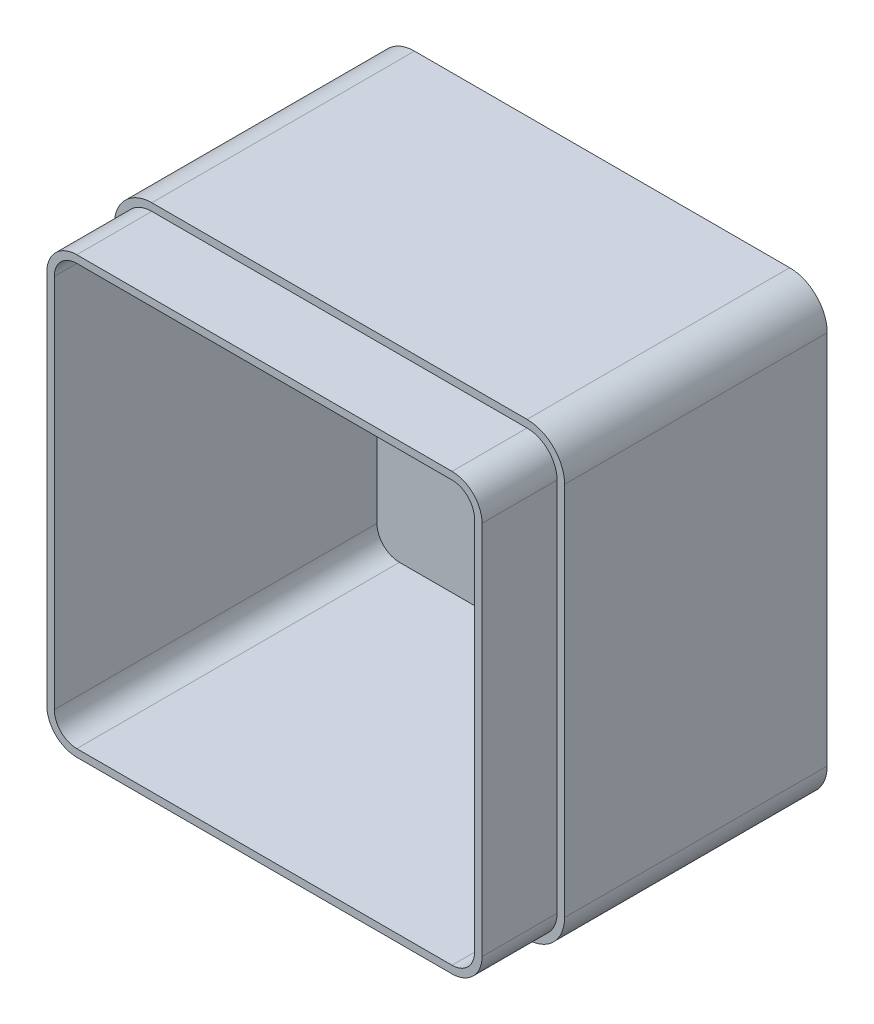
ISO-10303-21;
HEADER;
FILE_DESCRIPTION(('STEP AP214'),'2;1');
FILE_NAME('part.step','',(''),(''),'','','');
FILE_SCHEMA(('AUTOMOTIVE_DESIGN { 1 0 10303 214 1 1 1 1 }'));
ENDSEC;
DATA;
#1=APPLICATION_CONTEXT('core data for automotive mechanical design processes');
#2=APPLICATION_PROTOCOL_DEFINITION('international standard','automotive_design',2000,#1);
#3=PRODUCT_CONTEXT('',#1,'mechanical');
#4=PRODUCT('Part','Part','',(#3));
#5=PRODUCT_RELATED_PRODUCT_CATEGORY('part','',(#4));
#6=PRODUCT_DEFINITION_FORMATION('','',#4);
#7=PRODUCT_DEFINITION_CONTEXT('part definition',#1,'design');
#8=PRODUCT_DEFINITION('design','',#6,#7);
#9=PRODUCT_DEFINITION_SHAPE('','',#8);
#10=(LENGTH_UNIT() NAMED_UNIT(*) SI_UNIT(.MILLI.,.METRE.));
#11=(NAMED_UNIT(*) PLANE_ANGLE_UNIT() SI_UNIT($,.RADIAN.));
#12=(NAMED_UNIT(*) SI_UNIT($,.STERADIAN.) SOLID_ANGLE_UNIT());
#13=UNCERTAINTY_MEASURE_WITH_UNIT(LENGTH_MEASURE(1.E-05),#10,'distance_accuracy_value','');
#14=(GEOMETRIC_REPRESENTATION_CONTEXT(3) GLOBAL_UNCERTAINTY_ASSIGNED_CONTEXT((#13)) GLOBAL_UNIT_ASSIGNED_CONTEXT((#10,
#11,#12)) REPRESENTATION_CONTEXT('',''));
#15=CARTESIAN_POINT('',(0.,0.,0.));
#16=DIRECTION('',(0.,0.,1.));
#17=DIRECTION('',(1.,0.,0.));
#18=AXIS2_PLACEMENT_3D('',#15,#16,#17);
#19=CARTESIAN_POINT('',(0.,0.,90.));
#20=DIRECTION('',(0.,0.,1.));
#21=DIRECTION('',(1.,0.,0.));
#22=AXIS2_PLACEMENT_3D('',#19,#20,#21);
#23=PLANE('',#22);
#24=DIRECTION('',(0.,-1.,0.));
#25=VECTOR('',#24,1.);
#26=CARTESIAN_POINT('',(4.,0.,90.));
#27=LINE('',#26,#25);
#28=CARTESIAN_POINT('',(4.,-10.,90.));
#29=VERTEX_POINT('',#28);
#30=CARTESIAN_POINT('',(4.00000000000001,-110.,90.));
#31=VERTEX_POINT('',#30);
#32=EDGE_CURVE('E350',#29,#31,#27,.T.);
#33=ORIENTED_EDGE('',*,*,#32,.F.);
#34=CARTESIAN_POINT('',(10.,-10.,90.));
#35=DIRECTION('',(0.,0.,1.));
#36=DIRECTION('',(1.,0.,0.));
#37=AXIS2_PLACEMENT_3D('',#34,#35,#36);
#38=CIRCLE('',#37,6.);
#39=CARTESIAN_POINT('',(10.,-4.,90.));
#40=VERTEX_POINT('',#39);
#41=EDGE_CURVE('E328',#40,#29,#38,.T.);
#42=ORIENTED_EDGE('',*,*,#41,.F.);
#43=DIRECTION('',(-1.,0.,0.));
#44=VECTOR('',#43,1.);
#45=CARTESIAN_POINT('',(0.,-4.,90.));
#46=LINE('',#45,#44);
#47=CARTESIAN_POINT('',(110.,-4.,90.));
#48=VERTEX_POINT('',#47);
#49=EDGE_CURVE('E364',#48,#40,#46,.T.);
#50=ORIENTED_EDGE('',*,*,#49,.F.);
#51=CARTESIAN_POINT('',(110.,-10.,90.));
#52=DIRECTION('',(0.,0.,1.));
#53=DIRECTION('',(1.,0.,0.));
#54=AXIS2_PLACEMENT_3D('',#51,#52,#53);
#55=CIRCLE('',#54,6.);
#56=CARTESIAN_POINT('',(116.,-10.,90.));
#57=VERTEX_POINT('',#56);
#58=EDGE_CURVE('E395',#57,#48,#55,.T.);
#59=ORIENTED_EDGE('',*,*,#58,.F.);
#60=DIRECTION('',(0.,1.,0.));
#61=VECTOR('',#60,1.);
#62=CARTESIAN_POINT('',(116.,0.,90.));
#63=LINE('',#62,#61);
#64=CARTESIAN_POINT('',(116.,-110.,90.));
#65=VERTEX_POINT('',#64);
#66=EDGE_CURVE('E392',#65,#57,#63,.T.);
#67=ORIENTED_EDGE('',*,*,#66,.F.);
#68=CARTESIAN_POINT('',(110.,-110.,90.));
#69=DIRECTION('',(0.,0.,1.));
#70=DIRECTION('',(1.,0.,0.));
#71=AXIS2_PLACEMENT_3D('',#68,#69,#70);
#72=CIRCLE('',#71,6.);
#73=CARTESIAN_POINT('',(110.,-116.,90.));
#74=VERTEX_POINT('',#73);
#75=EDGE_CURVE('E388',#74,#65,#72,.T.);
#76=ORIENTED_EDGE('',*,*,#75,.F.);
#77=DIRECTION('',(1.,0.,0.));
#78=VECTOR('',#77,1.);
#79=CARTESIAN_POINT('',(0.,-116.,90.));
#80=LINE('',#79,#78);
#81=CARTESIAN_POINT('',(10.,-116.,90.));
#82=VERTEX_POINT('',#81);
#83=EDGE_CURVE('E385',#82,#74,#80,.T.);
#84=ORIENTED_EDGE('',*,*,#83,.F.);
#85=CARTESIAN_POINT('',(10.,-110.,90.));
#86=DIRECTION('',(0.,0.,1.));
#87=DIRECTION('',(1.,0.,0.));
#88=AXIS2_PLACEMENT_3D('',#85,#86,#87);
#89=CIRCLE('',#88,6.);
#90=EDGE_CURVE('E373',#31,#82,#89,.T.);
#91=ORIENTED_EDGE('',*,*,#90,.F.);
#92=EDGE_LOOP('',(#33,#42,#50,#59,#67,#76,#84,#91));
#93=FACE_BOUND('',#92,.T.);
#94=DIRECTION('',(-1.,0.,0.));
#95=VECTOR('',#94,1.);
#96=CARTESIAN_POINT('',(110.,-2.,90.));
#97=LINE('',#96,#95);
#98=CARTESIAN_POINT('',(110.,-2.,90.));
#99=VERTEX_POINT('',#98);
#100=CARTESIAN_POINT('',(9.99999999999999,-2.,90.));
#101=VERTEX_POINT('',#100);
#102=EDGE_CURVE('E229',#99,#101,#97,.T.);
#103=ORIENTED_EDGE('',*,*,#102,.T.);
#104=CARTESIAN_POINT('',(10.,-10.,90.));
#105=DIRECTION('',(0.,0.,1.));
#106=DIRECTION('',(1.,0.,0.));
#107=AXIS2_PLACEMENT_3D('',#104,#105,#106);
#108=CIRCLE('',#107,8.);
#109=CARTESIAN_POINT('',(2.,-10.,90.));
#110=VERTEX_POINT('',#109);
#111=EDGE_CURVE('E256',#101,#110,#108,.T.);
#112=ORIENTED_EDGE('',*,*,#111,.T.);
#113=DIRECTION('',(0.,-1.,0.));
#114=VECTOR('',#113,1.);
#115=CARTESIAN_POINT('',(2.,-10.,90.));
#116=LINE('',#115,#114);
#117=CARTESIAN_POINT('',(2.,-110.,90.));
#118=VERTEX_POINT('',#117);
#119=EDGE_CURVE('E206',#110,#118,#116,.T.);
#120=ORIENTED_EDGE('',*,*,#119,.T.);
#121=CARTESIAN_POINT('',(10.,-110.,90.));
#122=DIRECTION('',(0.,0.,1.));
#123=DIRECTION('',(1.,0.,0.));
#124=AXIS2_PLACEMENT_3D('',#121,#122,#123);
#125=CIRCLE('',#124,8.);
#126=CARTESIAN_POINT('',(10.,-118.,90.));
#127=VERTEX_POINT('',#126);
#128=EDGE_CURVE('E55',#118,#127,#125,.T.);
#129=ORIENTED_EDGE('',*,*,#128,.T.);
#130=DIRECTION('',(1.,0.,0.));
#131=VECTOR('',#130,1.);
#132=CARTESIAN_POINT('',(10.,-118.,90.));
#133=LINE('',#132,#131);
#134=CARTESIAN_POINT('',(110.,-118.,90.));
#135=VERTEX_POINT('',#134);
#136=EDGE_CURVE('E263',#127,#135,#133,.T.);
#137=ORIENTED_EDGE('',*,*,#136,.T.);
#138=CARTESIAN_POINT('',(110.,-110.,90.));
#139=DIRECTION('',(0.,0.,1.));
#140=DIRECTION('',(1.,0.,0.));
#141=AXIS2_PLACEMENT_3D('',#138,#139,#140);
#142=CIRCLE('',#141,7.99999999999999);
#143=CARTESIAN_POINT('',(118.,-110.,90.));
#144=VERTEX_POINT('',#143);
#145=EDGE_CURVE('E267',#135,#144,#142,.T.);
#146=ORIENTED_EDGE('',*,*,#145,.T.);
#147=DIRECTION('',(0.,1.,0.));
#148=VECTOR('',#147,1.);
#149=CARTESIAN_POINT('',(118.,-110.,90.));
#150=LINE('',#149,#148);
#151=CARTESIAN_POINT('',(118.,-9.99999999999999,90.));
#152=VERTEX_POINT('',#151);
#153=EDGE_CURVE('E271',#144,#152,#150,.T.);
#154=ORIENTED_EDGE('',*,*,#153,.T.);
#155=CARTESIAN_POINT('',(110.,-10.,90.));
#156=DIRECTION('',(0.,0.,1.));
#157=DIRECTION('',(1.,0.,0.));
#158=AXIS2_PLACEMENT_3D('',#155,#156,#157);
#159=CIRCLE('',#158,8.);
#160=EDGE_CURVE('E233',#152,#99,#159,.T.);
#161=ORIENTED_EDGE('',*,*,#160,.T.);
#162=EDGE_LOOP('',(#103,#112,#120,#129,#137,#146,#154,#161));
#163=FACE_BOUND('',#162,.T.);
#164=ADVANCED_FACE('F39',(#93,#163),#23,.T.);
#165=CARTESIAN_POINT('',(4.,0.,90.));
#166=DIRECTION('',(1.,0.,0.));
#167=DIRECTION('',(0.,1.,0.));
#168=AXIS2_PLACEMENT_3D('',#165,#166,#167);
#169=PLANE('',#168);
#170=DIRECTION('',(0.,-1.,0.));
#171=VECTOR('',#170,1.);
#172=CARTESIAN_POINT('',(4.,0.,4.));
#173=LINE('',#172,#171);
#174=CARTESIAN_POINT('',(4.,-10.,4.));
#175=VERTEX_POINT('',#174);
#176=CARTESIAN_POINT('',(4.00000000000001,-110.,4.));
#177=VERTEX_POINT('',#176);
#178=EDGE_CURVE('E320',#175,#177,#173,.T.);
#179=ORIENTED_EDGE('',*,*,#178,.F.);
#180=DIRECTION('',(0.,0.,1.));
#181=VECTOR('',#180,1.);
#182=CARTESIAN_POINT('',(4.,-10.,90.));
#183=LINE('',#182,#181);
#184=EDGE_CURVE('E329',#29,#175,#183,.F.);
#185=ORIENTED_EDGE('',*,*,#184,.F.);
#186=ORIENTED_EDGE('',*,*,#32,.T.);
#187=DIRECTION('',(0.,0.,1.));
#188=VECTOR('',#187,1.);
#189=CARTESIAN_POINT('',(4.00000000000001,-110.,90.));
#190=LINE('',#189,#188);
#191=EDGE_CURVE('E325',#177,#31,#190,.T.);
#192=ORIENTED_EDGE('',*,*,#191,.F.);
#193=EDGE_LOOP('',(#179,#185,#186,#192));
#194=FACE_BOUND('',#193,.T.);
#195=ADVANCED_FACE('F504',(#194),#169,.T.);
#196=CARTESIAN_POINT('',(0.,-116.,90.));
#197=DIRECTION('',(0.,1.,0.));
#198=DIRECTION('',(0.,0.,1.));
#199=AXIS2_PLACEMENT_3D('',#196,#197,#198);
#200=PLANE('',#199);
#201=ORIENTED_EDGE('',*,*,#83,.T.);
#202=DIRECTION('',(0.,0.,1.));
#203=VECTOR('',#202,1.);
#204=CARTESIAN_POINT('',(110.,-116.,90.));
#205=LINE('',#204,#203);
#206=CARTESIAN_POINT('',(110.,-116.,4.));
#207=VERTEX_POINT('',#206);
#208=EDGE_CURVE('E361',#207,#74,#205,.T.);
#209=ORIENTED_EDGE('',*,*,#208,.F.);
#210=DIRECTION('',(1.,0.,0.));
#211=VECTOR('',#210,1.);
#212=CARTESIAN_POINT('',(0.,-116.,4.));
#213=LINE('',#212,#211);
#214=CARTESIAN_POINT('',(10.,-116.,4.));
#215=VERTEX_POINT('',#214);
#216=EDGE_CURVE('E324',#215,#207,#213,.T.);
#217=ORIENTED_EDGE('',*,*,#216,.F.);
#218=DIRECTION('',(0.,0.,1.));
#219=VECTOR('',#218,1.);
#220=CARTESIAN_POINT('',(10.,-116.,90.));
#221=LINE('',#220,#219);
#222=EDGE_CURVE('E345',#82,#215,#221,.F.);
#223=ORIENTED_EDGE('',*,*,#222,.F.);
#224=EDGE_LOOP('',(#201,#209,#217,#223));
#225=FACE_BOUND('',#224,.T.);
#226=ADVANCED_FACE('F509',(#225),#200,.T.);
#227=CARTESIAN_POINT('',(116.,0.,90.));
#228=DIRECTION('',(-1.,0.,0.));
#229=DIRECTION('',(0.,-1.,0.));
#230=AXIS2_PLACEMENT_3D('',#227,#228,#229);
#231=PLANE('',#230);
#232=ORIENTED_EDGE('',*,*,#66,.T.);
#233=DIRECTION('',(0.,0.,1.));
#234=VECTOR('',#233,1.);
#235=CARTESIAN_POINT('',(116.,-10.,90.));
#236=LINE('',#235,#234);
#237=CARTESIAN_POINT('',(116.,-10.,4.));
#238=VERTEX_POINT('',#237);
#239=EDGE_CURVE('E370',#238,#57,#236,.T.);
#240=ORIENTED_EDGE('',*,*,#239,.F.);
#241=DIRECTION('',(0.,1.,0.));
#242=VECTOR('',#241,1.);
#243=CARTESIAN_POINT('',(116.,0.,4.));
#244=LINE('',#243,#242);
#245=CARTESIAN_POINT('',(116.,-110.,4.));
#246=VERTEX_POINT('',#245);
#247=EDGE_CURVE('E337',#246,#238,#244,.T.);
#248=ORIENTED_EDGE('',*,*,#247,.F.);
#249=DIRECTION('',(0.,0.,1.));
#250=VECTOR('',#249,1.);
#251=CARTESIAN_POINT('',(116.,-110.,90.));
#252=LINE('',#251,#250);
#253=EDGE_CURVE('E365',#65,#246,#252,.F.);
#254=ORIENTED_EDGE('',*,*,#253,.F.);
#255=EDGE_LOOP('',(#232,#240,#248,#254));
#256=FACE_BOUND('',#255,.T.);
#257=ADVANCED_FACE('F538',(#256),#231,.T.);
#258=CARTESIAN_POINT('',(0.,-4.,90.));
#259=DIRECTION('',(0.,-1.,0.));
#260=DIRECTION('',(0.,0.,-1.));
#261=AXIS2_PLACEMENT_3D('',#258,#259,#260);
#262=PLANE('',#261);
#263=ORIENTED_EDGE('',*,*,#49,.T.);
#264=DIRECTION('',(0.,0.,-1.));
#265=VECTOR('',#264,1.);
#266=CARTESIAN_POINT('',(10.,-4.,90.));
#267=LINE('',#266,#265);
#268=CARTESIAN_POINT('',(10.,-4.,4.));
#269=VERTEX_POINT('',#268);
#270=EDGE_CURVE('E369',#269,#40,#267,.F.);
#271=ORIENTED_EDGE('',*,*,#270,.F.);
#272=DIRECTION('',(-1.,0.,0.));
#273=VECTOR('',#272,1.);
#274=CARTESIAN_POINT('',(0.,-4.,4.));
#275=LINE('',#274,#273);
#276=CARTESIAN_POINT('',(110.,-4.,4.));
#277=VERTEX_POINT('',#276);
#278=EDGE_CURVE('E346',#277,#269,#275,.T.);
#279=ORIENTED_EDGE('',*,*,#278,.F.);
#280=DIRECTION('',(0.,0.,-1.));
#281=VECTOR('',#280,1.);
#282=CARTESIAN_POINT('',(110.,-4.,90.));
#283=LINE('',#282,#281);
#284=EDGE_CURVE('E374',#48,#277,#283,.T.);
#285=ORIENTED_EDGE('',*,*,#284,.F.);
#286=EDGE_LOOP('',(#263,#271,#279,#285));
#287=FACE_BOUND('',#286,.T.);
#288=ADVANCED_FACE('F534',(#287),#262,.T.);
#289=CARTESIAN_POINT('',(0.,0.,4.));
#290=DIRECTION('',(0.,0.,1.));
#291=DIRECTION('',(1.,0.,0.));
#292=AXIS2_PLACEMENT_3D('',#289,#290,#291);
#293=PLANE('',#292);
#294=ORIENTED_EDGE('',*,*,#216,.T.);
#295=CARTESIAN_POINT('',(110.,-110.,4.));
#296=DIRECTION('',(0.,0.,1.));
#297=DIRECTION('',(1.,0.,0.));
#298=AXIS2_PLACEMENT_3D('',#295,#296,#297);
#299=CIRCLE('',#298,6.);
#300=EDGE_CURVE('E340',#246,#207,#299,.F.);
#301=ORIENTED_EDGE('',*,*,#300,.F.);
#302=ORIENTED_EDGE('',*,*,#247,.T.);
#303=CARTESIAN_POINT('',(110.,-10.,4.));
#304=DIRECTION('',(0.,0.,1.));
#305=DIRECTION('',(1.,0.,0.));
#306=AXIS2_PLACEMENT_3D('',#303,#304,#305);
#307=CIRCLE('',#306,6.);
#308=EDGE_CURVE('E344',#277,#238,#307,.F.);
#309=ORIENTED_EDGE('',*,*,#308,.F.);
#310=ORIENTED_EDGE('',*,*,#278,.T.);
#311=CARTESIAN_POINT('',(10.,-10.,4.));
#312=DIRECTION('',(0.,0.,1.));
#313=DIRECTION('',(1.,0.,0.));
#314=AXIS2_PLACEMENT_3D('',#311,#312,#313);
#315=CIRCLE('',#314,6.);
#316=EDGE_CURVE('E341',#175,#269,#315,.F.);
#317=ORIENTED_EDGE('',*,*,#316,.F.);
#318=ORIENTED_EDGE('',*,*,#178,.T.);
#319=CARTESIAN_POINT('',(10.,-110.,4.));
#320=DIRECTION('',(0.,0.,1.));
#321=DIRECTION('',(1.,0.,0.));
#322=AXIS2_PLACEMENT_3D('',#319,#320,#321);
#323=CIRCLE('',#322,6.);
#324=EDGE_CURVE('E333',#215,#177,#323,.F.);
#325=ORIENTED_EDGE('',*,*,#324,.F.);
#326=EDGE_LOOP('',(#294,#301,#302,#309,#310,#317,#318,#325));
#327=FACE_BOUND('',#326,.T.);
#328=ADVANCED_FACE('F530',(#327),#293,.T.);
#329=CARTESIAN_POINT('',(10.,-110.,90.));
#330=DIRECTION('',(0.,0.,-1.));
#331=DIRECTION('',(-1.,0.,0.));
#332=AXIS2_PLACEMENT_3D('',#329,#330,#331);
#333=CYLINDRICAL_SURFACE('',#332,6.);
#334=ORIENTED_EDGE('',*,*,#90,.T.);
#335=ORIENTED_EDGE('',*,*,#222,.T.);
#336=ORIENTED_EDGE('',*,*,#324,.T.);
#337=ORIENTED_EDGE('',*,*,#191,.T.);
#338=EDGE_LOOP('',(#334,#335,#336,#337));
#339=FACE_BOUND('',#338,.T.);
#340=ADVANCED_FACE('F526',(#339),#333,.F.);
#341=CARTESIAN_POINT('',(110.,-110.,90.));
#342=DIRECTION('',(0.,0.,-1.));
#343=DIRECTION('',(-1.,0.,0.));
#344=AXIS2_PLACEMENT_3D('',#341,#342,#343);
#345=CYLINDRICAL_SURFACE('',#344,6.);
#346=ORIENTED_EDGE('',*,*,#75,.T.);
#347=ORIENTED_EDGE('',*,*,#253,.T.);
#348=ORIENTED_EDGE('',*,*,#300,.T.);
#349=ORIENTED_EDGE('',*,*,#208,.T.);
#350=EDGE_LOOP('',(#346,#347,#348,#349));
#351=FACE_BOUND('',#350,.T.);
#352=ADVANCED_FACE('F522',(#351),#345,.F.);
#353=CARTESIAN_POINT('',(110.,-10.,90.));
#354=DIRECTION('',(0.,0.,-1.));
#355=DIRECTION('',(-1.,0.,0.));
#356=AXIS2_PLACEMENT_3D('',#353,#354,#355);
#357=CYLINDRICAL_SURFACE('',#356,6.);
#358=ORIENTED_EDGE('',*,*,#58,.T.);
#359=ORIENTED_EDGE('',*,*,#284,.T.);
#360=ORIENTED_EDGE('',*,*,#308,.T.);
#361=ORIENTED_EDGE('',*,*,#239,.T.);
#362=EDGE_LOOP('',(#358,#359,#360,#361));
#363=FACE_BOUND('',#362,.T.);
#364=ADVANCED_FACE('F518',(#363),#357,.F.);
#365=CARTESIAN_POINT('',(10.,-10.,90.));
#366=DIRECTION('',(0.,0.,-1.));
#367=DIRECTION('',(-1.,0.,0.));
#368=AXIS2_PLACEMENT_3D('',#365,#366,#367);
#369=CYLINDRICAL_SURFACE('',#368,6.);
#370=ORIENTED_EDGE('',*,*,#41,.T.);
#371=ORIENTED_EDGE('',*,*,#184,.T.);
#372=ORIENTED_EDGE('',*,*,#316,.T.);
#373=ORIENTED_EDGE('',*,*,#270,.T.);
#374=EDGE_LOOP('',(#370,#371,#372,#373));
#375=FACE_BOUND('',#374,.T.);
#376=ADVANCED_FACE('F515',(#375),#369,.F.);
#377=CARTESIAN_POINT('',(10.,-10.,70.));
#378=DIRECTION('',(0.,0.,1.));
#379=DIRECTION('',(1.,0.,0.));
#380=AXIS2_PLACEMENT_3D('',#377,#378,#379);
#381=PLANE('',#380);
#382=DIRECTION('',(-1.,0.,0.));
#383=VECTOR('',#382,1.);
#384=CARTESIAN_POINT('',(110.,-2.,70.));
#385=LINE('',#384,#383);
#386=CARTESIAN_POINT('',(110.,-2.,70.));
#387=VERTEX_POINT('',#386);
#388=CARTESIAN_POINT('',(9.99999999999999,-2.,70.));
#389=VERTEX_POINT('',#388);
#390=EDGE_CURVE('E213',#387,#389,#385,.T.);
#391=ORIENTED_EDGE('',*,*,#390,.F.);
#392=CARTESIAN_POINT('',(110.,-10.,70.));
#393=DIRECTION('',(0.,0.,1.));
#394=DIRECTION('',(1.,0.,0.));
#395=AXIS2_PLACEMENT_3D('',#392,#393,#394);
#396=CIRCLE('',#395,8.);
#397=CARTESIAN_POINT('',(118.,-9.99999999999999,70.));
#398=VERTEX_POINT('',#397);
#399=EDGE_CURVE('E250',#398,#387,#396,.T.);
#400=ORIENTED_EDGE('',*,*,#399,.F.);
#401=DIRECTION('',(0.,1.,0.));
#402=VECTOR('',#401,1.);
#403=CARTESIAN_POINT('',(118.,-110.,70.));
#404=LINE('',#403,#402);
#405=CARTESIAN_POINT('',(118.,-110.,70.));
#406=VERTEX_POINT('',#405);
#407=EDGE_CURVE('E246',#406,#398,#404,.T.);
#408=ORIENTED_EDGE('',*,*,#407,.F.);
#409=CARTESIAN_POINT('',(110.,-110.,70.));
#410=DIRECTION('',(0.,0.,1.));
#411=DIRECTION('',(1.,0.,0.));
#412=AXIS2_PLACEMENT_3D('',#409,#410,#411);
#413=CIRCLE('',#412,7.99999999999999);
#414=CARTESIAN_POINT('',(110.,-118.,70.));
#415=VERTEX_POINT('',#414);
#416=EDGE_CURVE('E242',#415,#406,#413,.T.);
#417=ORIENTED_EDGE('',*,*,#416,.F.);
#418=DIRECTION('',(1.,0.,0.));
#419=VECTOR('',#418,1.);
#420=CARTESIAN_POINT('',(10.,-118.,70.));
#421=LINE('',#420,#419);
#422=CARTESIAN_POINT('',(10.,-118.,70.));
#423=VERTEX_POINT('',#422);
#424=EDGE_CURVE('E238',#423,#415,#421,.T.);
#425=ORIENTED_EDGE('',*,*,#424,.F.);
#426=CARTESIAN_POINT('',(10.,-110.,70.));
#427=DIRECTION('',(0.,0.,1.));
#428=DIRECTION('',(1.,0.,0.));
#429=AXIS2_PLACEMENT_3D('',#426,#427,#428);
#430=CIRCLE('',#429,8.);
#431=CARTESIAN_POINT('',(2.,-110.,70.));
#432=VERTEX_POINT('',#431);
#433=EDGE_CURVE('E223',#432,#423,#430,.T.);
#434=ORIENTED_EDGE('',*,*,#433,.F.);
#435=DIRECTION('',(0.,-1.,0.));
#436=VECTOR('',#435,1.);
#437=CARTESIAN_POINT('',(2.,-10.,70.));
#438=LINE('',#437,#436);
#439=CARTESIAN_POINT('',(2.,-10.,70.));
#440=VERTEX_POINT('',#439);
#441=EDGE_CURVE('E204',#440,#432,#438,.T.);
#442=ORIENTED_EDGE('',*,*,#441,.F.);
#443=CARTESIAN_POINT('',(10.,-10.,70.));
#444=DIRECTION('',(0.,0.,1.));
#445=DIRECTION('',(1.,0.,0.));
#446=AXIS2_PLACEMENT_3D('',#443,#444,#445);
#447=CIRCLE('',#446,8.);
#448=EDGE_CURVE('E219',#389,#440,#447,.T.);
#449=ORIENTED_EDGE('',*,*,#448,.F.);
#450=EDGE_LOOP('',(#391,#400,#408,#417,#425,#434,#442,#449));
#451=FACE_BOUND('',#450,.T.);
#452=CARTESIAN_POINT('',(10.,-10.,70.));
#453=DIRECTION('',(0.,0.,1.));
#454=DIRECTION('',(1.,0.,0.));
#455=AXIS2_PLACEMENT_3D('',#452,#453,#454);
#456=CIRCLE('',#455,10.);
#457=CARTESIAN_POINT('',(10.,0.,70.));
#458=VERTEX_POINT('',#457);
#459=CARTESIAN_POINT('',(0.,-10.,70.));
#460=VERTEX_POINT('',#459);
#461=EDGE_CURVE('E280',#458,#460,#456,.T.);
#462=ORIENTED_EDGE('',*,*,#461,.T.);
#463=DIRECTION('',(0.,-1.,0.));
#464=VECTOR('',#463,1.);
#465=CARTESIAN_POINT('',(0.,-10.,70.));
#466=LINE('',#465,#464);
#467=CARTESIAN_POINT('',(0.,-110.,70.));
#468=VERTEX_POINT('',#467);
#469=EDGE_CURVE('E300',#460,#468,#466,.T.);
#470=ORIENTED_EDGE('',*,*,#469,.T.);
#471=CARTESIAN_POINT('',(10.,-110.,70.));
#472=DIRECTION('',(0.,0.,1.));
#473=DIRECTION('',(1.,0.,0.));
#474=AXIS2_PLACEMENT_3D('',#471,#472,#473);
#475=CIRCLE('',#474,9.99999999999999);
#476=CARTESIAN_POINT('',(10.,-120.,70.));
#477=VERTEX_POINT('',#476);
#478=EDGE_CURVE('E303',#468,#477,#475,.T.);
#479=ORIENTED_EDGE('',*,*,#478,.T.);
#480=DIRECTION('',(1.,0.,0.));
#481=VECTOR('',#480,1.);
#482=CARTESIAN_POINT('',(10.,-120.,70.));
#483=LINE('',#482,#481);
#484=CARTESIAN_POINT('',(110.,-120.,70.));
#485=VERTEX_POINT('',#484);
#486=EDGE_CURVE('E306',#477,#485,#483,.T.);
#487=ORIENTED_EDGE('',*,*,#486,.T.);
#488=CARTESIAN_POINT('',(110.,-110.,70.));
#489=DIRECTION('',(0.,0.,1.));
#490=DIRECTION('',(1.,0.,0.));
#491=AXIS2_PLACEMENT_3D('',#488,#489,#490);
#492=CIRCLE('',#491,9.99999999999999);
#493=CARTESIAN_POINT('',(120.,-110.,70.));
#494=VERTEX_POINT('',#493);
#495=EDGE_CURVE('E309',#485,#494,#492,.T.);
#496=ORIENTED_EDGE('',*,*,#495,.T.);
#497=DIRECTION('',(0.,1.,0.));
#498=VECTOR('',#497,1.);
#499=CARTESIAN_POINT('',(120.,-110.,70.));
#500=LINE('',#499,#498);
#501=CARTESIAN_POINT('',(120.,-10.,70.));
#502=VERTEX_POINT('',#501);
#503=EDGE_CURVE('E312',#494,#502,#500,.T.);
#504=ORIENTED_EDGE('',*,*,#503,.T.);
#505=CARTESIAN_POINT('',(110.,-10.,70.));
#506=DIRECTION('',(0.,0.,1.));
#507=DIRECTION('',(1.,0.,0.));
#508=AXIS2_PLACEMENT_3D('',#505,#506,#507);
#509=CIRCLE('',#508,9.99999999999999);
#510=CARTESIAN_POINT('',(110.,0.,70.));
#511=VERTEX_POINT('',#510);
#512=EDGE_CURVE('E315',#502,#511,#509,.T.);
#513=ORIENTED_EDGE('',*,*,#512,.T.);
#514=DIRECTION('',(-1.,0.,0.));
#515=VECTOR('',#514,1.);
#516=CARTESIAN_POINT('',(110.,0.,70.));
#517=LINE('',#516,#515);
#518=EDGE_CURVE('E63',#511,#458,#517,.T.);
#519=ORIENTED_EDGE('',*,*,#518,.T.);
#520=EDGE_LOOP('',(#462,#470,#479,#487,#496,#504,#513,#519));
#521=FACE_BOUND('',#520,.T.);
#522=ADVANCED_FACE('F218',(#451,#521),#381,.T.);
#523=CARTESIAN_POINT('',(10.,-10.,70.));
#524=DIRECTION('',(0.,0.,1.));
#525=DIRECTION('',(1.,0.,0.));
#526=AXIS2_PLACEMENT_3D('',#523,#524,#525);
#527=CYLINDRICAL_SURFACE('',#526,8.);
#528=ORIENTED_EDGE('',*,*,#111,.F.);
#529=DIRECTION('',(0.,0.,1.));
#530=VECTOR('',#529,1.);
#531=CARTESIAN_POINT('',(9.99999999999999,-2.,70.));
#532=LINE('',#531,#530);
#533=EDGE_CURVE('E227',#389,#101,#532,.T.);
#534=ORIENTED_EDGE('',*,*,#533,.F.);
#535=ORIENTED_EDGE('',*,*,#448,.T.);
#536=DIRECTION('',(0.,0.,1.));
#537=VECTOR('',#536,1.);
#538=CARTESIAN_POINT('',(2.,-10.,70.));
#539=LINE('',#538,#537);
#540=EDGE_CURVE('E201',#440,#110,#539,.T.);
#541=ORIENTED_EDGE('',*,*,#540,.T.);
#542=EDGE_LOOP('',(#528,#534,#535,#541));
#543=FACE_BOUND('',#542,.T.);
#544=ADVANCED_FACE('F226',(#543),#527,.T.);
#545=CARTESIAN_POINT('',(110.,-2.,70.));
#546=DIRECTION('',(0.,1.,0.));
#547=DIRECTION('',(-1.,0.,0.));
#548=AXIS2_PLACEMENT_3D('',#545,#546,#547);
#549=PLANE('',#548);
#550=ORIENTED_EDGE('',*,*,#102,.F.);
#551=DIRECTION('',(0.,0.,1.));
#552=VECTOR('',#551,1.);
#553=CARTESIAN_POINT('',(110.,-2.,70.));
#554=LINE('',#553,#552);
#555=EDGE_CURVE('E281',#387,#99,#554,.T.);
#556=ORIENTED_EDGE('',*,*,#555,.F.);
#557=ORIENTED_EDGE('',*,*,#390,.T.);
#558=ORIENTED_EDGE('',*,*,#533,.T.);
#559=EDGE_LOOP('',(#550,#556,#557,#558));
#560=FACE_BOUND('',#559,.T.);
#561=ADVANCED_FACE('F549',(#560),#549,.T.);
#562=CARTESIAN_POINT('',(110.,-10.,70.));
#563=DIRECTION('',(0.,0.,1.));
#564=DIRECTION('',(1.,0.,0.));
#565=AXIS2_PLACEMENT_3D('',#562,#563,#564);
#566=CYLINDRICAL_SURFACE('',#565,8.);
#567=ORIENTED_EDGE('',*,*,#160,.F.);
#568=DIRECTION('',(0.,0.,1.));
#569=VECTOR('',#568,1.);
#570=CARTESIAN_POINT('',(118.,-9.99999999999999,70.));
#571=LINE('',#570,#569);
#572=EDGE_CURVE('E284',#398,#152,#571,.T.);
#573=ORIENTED_EDGE('',*,*,#572,.F.);
#574=ORIENTED_EDGE('',*,*,#399,.T.);
#575=ORIENTED_EDGE('',*,*,#555,.T.);
#576=EDGE_LOOP('',(#567,#573,#574,#575));
#577=FACE_BOUND('',#576,.T.);
#578=ADVANCED_FACE('F564',(#577),#566,.T.);
#579=CARTESIAN_POINT('',(118.,-110.,70.));
#580=DIRECTION('',(1.,0.,0.));
#581=DIRECTION('',(0.,0.,-1.));
#582=AXIS2_PLACEMENT_3D('',#579,#580,#581);
#583=PLANE('',#582);
#584=ORIENTED_EDGE('',*,*,#153,.F.);
#585=DIRECTION('',(0.,0.,1.));
#586=VECTOR('',#585,1.);
#587=CARTESIAN_POINT('',(118.,-110.,70.));
#588=LINE('',#587,#586);
#589=EDGE_CURVE('E287',#406,#144,#588,.T.);
#590=ORIENTED_EDGE('',*,*,#589,.F.);
#591=ORIENTED_EDGE('',*,*,#407,.T.);
#592=ORIENTED_EDGE('',*,*,#572,.T.);
#593=EDGE_LOOP('',(#584,#590,#591,#592));
#594=FACE_BOUND('',#593,.T.);
#595=ADVANCED_FACE('F560',(#594),#583,.T.);
#596=CARTESIAN_POINT('',(110.,-110.,70.));
#597=DIRECTION('',(0.,0.,1.));
#598=DIRECTION('',(1.,0.,0.));
#599=AXIS2_PLACEMENT_3D('',#596,#597,#598);
#600=CYLINDRICAL_SURFACE('',#599,7.99999999999999);
#601=ORIENTED_EDGE('',*,*,#145,.F.);
#602=DIRECTION('',(0.,0.,1.));
#603=VECTOR('',#602,1.);
#604=CARTESIAN_POINT('',(110.,-118.,70.));
#605=LINE('',#604,#603);
#606=EDGE_CURVE('E290',#415,#135,#605,.T.);
#607=ORIENTED_EDGE('',*,*,#606,.F.);
#608=ORIENTED_EDGE('',*,*,#416,.T.);
#609=ORIENTED_EDGE('',*,*,#589,.T.);
#610=EDGE_LOOP('',(#601,#607,#608,#609));
#611=FACE_BOUND('',#610,.T.);
#612=ADVANCED_FACE('F556',(#611),#600,.T.);
#613=CARTESIAN_POINT('',(10.,-118.,70.));
#614=DIRECTION('',(0.,-1.,0.));
#615=DIRECTION('',(0.,0.,-1.));
#616=AXIS2_PLACEMENT_3D('',#613,#614,#615);
#617=PLANE('',#616);
#618=ORIENTED_EDGE('',*,*,#136,.F.);
#619=DIRECTION('',(0.,0.,1.));
#620=VECTOR('',#619,1.);
#621=CARTESIAN_POINT('',(10.,-118.,70.));
#622=LINE('',#621,#620);
#623=EDGE_CURVE('E293',#423,#127,#622,.T.);
#624=ORIENTED_EDGE('',*,*,#623,.F.);
#625=ORIENTED_EDGE('',*,*,#424,.T.);
#626=ORIENTED_EDGE('',*,*,#606,.T.);
#627=EDGE_LOOP('',(#618,#624,#625,#626));
#628=FACE_BOUND('',#627,.T.);
#629=ADVANCED_FACE('F553',(#628),#617,.T.);
#630=CARTESIAN_POINT('',(10.,-110.,70.));
#631=DIRECTION('',(0.,0.,1.));
#632=DIRECTION('',(1.,0.,0.));
#633=AXIS2_PLACEMENT_3D('',#630,#631,#632);
#634=CYLINDRICAL_SURFACE('',#633,8.);
#635=ORIENTED_EDGE('',*,*,#128,.F.);
#636=DIRECTION('',(0.,0.,1.));
#637=VECTOR('',#636,1.);
#638=CARTESIAN_POINT('',(2.,-110.,70.));
#639=LINE('',#638,#637);
#640=EDGE_CURVE('E212',#432,#118,#639,.T.);
#641=ORIENTED_EDGE('',*,*,#640,.F.);
#642=ORIENTED_EDGE('',*,*,#433,.T.);
#643=ORIENTED_EDGE('',*,*,#623,.T.);
#644=EDGE_LOOP('',(#635,#641,#642,#643));
#645=FACE_BOUND('',#644,.T.);
#646=ADVANCED_FACE('F499',(#645),#634,.T.);
#647=CARTESIAN_POINT('',(2.,-10.,70.));
#648=DIRECTION('',(-1.,0.,0.));
#649=DIRECTION('',(0.,0.,1.));
#650=AXIS2_PLACEMENT_3D('',#647,#648,#649);
#651=PLANE('',#650);
#652=ORIENTED_EDGE('',*,*,#119,.F.);
#653=ORIENTED_EDGE('',*,*,#540,.F.);
#654=ORIENTED_EDGE('',*,*,#441,.T.);
#655=ORIENTED_EDGE('',*,*,#640,.T.);
#656=EDGE_LOOP('',(#652,#653,#654,#655));
#657=FACE_BOUND('',#656,.T.);
#658=ADVANCED_FACE('F203',(#657),#651,.T.);
#659=CARTESIAN_POINT('',(0.,0.,0.));
#660=DIRECTION('',(0.,0.,1.));
#661=DIRECTION('',(1.,0.,0.));
#662=AXIS2_PLACEMENT_3D('',#659,#660,#661);
#663=PLANE('',#662);
#664=DIRECTION('',(1.,0.,0.));
#665=VECTOR('',#664,1.);
#666=CARTESIAN_POINT('',(0.,-120.,0.));
#667=LINE('',#666,#665);
#668=CARTESIAN_POINT('',(10.,-120.,0.));
#669=VERTEX_POINT('',#668);
#670=CARTESIAN_POINT('',(110.,-120.,0.));
#671=VERTEX_POINT('',#670);
#672=EDGE_CURVE('E408',#669,#671,#667,.T.);
#673=ORIENTED_EDGE('',*,*,#672,.F.);
#674=CARTESIAN_POINT('',(10.,-110.,0.));
#675=DIRECTION('',(0.,0.,1.));
#676=DIRECTION('',(1.,0.,0.));
#677=AXIS2_PLACEMENT_3D('',#674,#675,#676);
#678=CIRCLE('',#677,10.);
#679=CARTESIAN_POINT('',(0.,-110.,0.));
#680=VERTEX_POINT('',#679);
#681=EDGE_CURVE('E436',#669,#680,#678,.F.);
#682=ORIENTED_EDGE('',*,*,#681,.T.);
#683=DIRECTION('',(0.,-1.,0.));
#684=VECTOR('',#683,1.);
#685=CARTESIAN_POINT('',(0.,0.,0.));
#686=LINE('',#685,#684);
#687=CARTESIAN_POINT('',(0.,-10.,0.));
#688=VERTEX_POINT('',#687);
#689=EDGE_CURVE('E378',#688,#680,#686,.T.);
#690=ORIENTED_EDGE('',*,*,#689,.F.);
#691=CARTESIAN_POINT('',(10.,-10.,0.));
#692=DIRECTION('',(0.,0.,1.));
#693=DIRECTION('',(1.,0.,0.));
#694=AXIS2_PLACEMENT_3D('',#691,#692,#693);
#695=CIRCLE('',#694,10.);
#696=CARTESIAN_POINT('',(10.,0.,0.));
#697=VERTEX_POINT('',#696);
#698=EDGE_CURVE('E427',#688,#697,#695,.F.);
#699=ORIENTED_EDGE('',*,*,#698,.T.);
#700=DIRECTION('',(-1.,0.,0.));
#701=VECTOR('',#700,1.);
#702=CARTESIAN_POINT('',(0.,0.,0.));
#703=LINE('',#702,#701);
#704=CARTESIAN_POINT('',(110.,0.,0.));
#705=VERTEX_POINT('',#704);
#706=EDGE_CURVE('E416',#705,#697,#703,.T.);
#707=ORIENTED_EDGE('',*,*,#706,.F.);
#708=CARTESIAN_POINT('',(110.,-10.,0.));
#709=DIRECTION('',(0.,0.,1.));
#710=DIRECTION('',(1.,0.,0.));
#711=AXIS2_PLACEMENT_3D('',#708,#709,#710);
#712=CIRCLE('',#711,10.);
#713=CARTESIAN_POINT('',(120.,-10.,0.));
#714=VERTEX_POINT('',#713);
#715=EDGE_CURVE('E430',#705,#714,#712,.F.);
#716=ORIENTED_EDGE('',*,*,#715,.T.);
#717=DIRECTION('',(0.,1.,0.));
#718=VECTOR('',#717,1.);
#719=CARTESIAN_POINT('',(120.,0.,0.));
#720=LINE('',#719,#718);
#721=CARTESIAN_POINT('',(120.,-110.,0.));
#722=VERTEX_POINT('',#721);
#723=EDGE_CURVE('E412',#722,#714,#720,.T.);
#724=ORIENTED_EDGE('',*,*,#723,.F.);
#725=CARTESIAN_POINT('',(110.,-110.,0.));
#726=DIRECTION('',(0.,0.,1.));
#727=DIRECTION('',(1.,0.,0.));
#728=AXIS2_PLACEMENT_3D('',#725,#726,#727);
#729=CIRCLE('',#728,10.);
#730=EDGE_CURVE('E433',#722,#671,#729,.F.);
#731=ORIENTED_EDGE('',*,*,#730,.T.);
#732=EDGE_LOOP('',(#673,#682,#690,#699,#707,#716,#724,#731));
#733=FACE_BOUND('',#732,.T.);
#734=ADVANCED_FACE('F492',(#733),#663,.F.);
#735=CARTESIAN_POINT('',(10.,-10.,90.));
#736=DIRECTION('',(0.,0.,-1.));
#737=DIRECTION('',(-1.,0.,0.));
#738=AXIS2_PLACEMENT_3D('',#735,#736,#737);
#739=CYLINDRICAL_SURFACE('',#738,10.);
#740=DIRECTION('',(0.,0.,-1.));
#741=VECTOR('',#740,1.);
#742=CARTESIAN_POINT('',(0.,-10.,90.));
#743=LINE('',#742,#741);
#744=EDGE_CURVE('E439',#460,#688,#743,.T.);
#745=ORIENTED_EDGE('',*,*,#744,.F.);
#746=ORIENTED_EDGE('',*,*,#461,.F.);
#747=DIRECTION('',(0.,0.,-1.));
#748=VECTOR('',#747,1.);
#749=CARTESIAN_POINT('',(10.,0.,90.));
#750=LINE('',#749,#748);
#751=EDGE_CURVE('E48',#697,#458,#750,.F.);
#752=ORIENTED_EDGE('',*,*,#751,.F.);
#753=ORIENTED_EDGE('',*,*,#698,.F.);
#754=EDGE_LOOP('',(#745,#746,#752,#753));
#755=FACE_BOUND('',#754,.T.);
#756=ADVANCED_FACE('F41',(#755),#739,.T.);
#757=CARTESIAN_POINT('',(110.,-10.,90.));
#758=DIRECTION('',(0.,0.,-1.));
#759=DIRECTION('',(-1.,0.,0.));
#760=AXIS2_PLACEMENT_3D('',#757,#758,#759);
#761=CYLINDRICAL_SURFACE('',#760,10.);
#762=DIRECTION('',(0.,0.,-1.));
#763=VECTOR('',#762,1.);
#764=CARTESIAN_POINT('',(110.,0.,90.));
#765=LINE('',#764,#763);
#766=EDGE_CURVE('E11',#511,#705,#765,.T.);
#767=ORIENTED_EDGE('',*,*,#766,.F.);
#768=ORIENTED_EDGE('',*,*,#512,.F.);
#769=DIRECTION('',(0.,0.,-1.));
#770=VECTOR('',#769,1.);
#771=CARTESIAN_POINT('',(120.,-10.,90.));
#772=LINE('',#771,#770);
#773=EDGE_CURVE('E446',#714,#502,#772,.F.);
#774=ORIENTED_EDGE('',*,*,#773,.F.);
#775=ORIENTED_EDGE('',*,*,#715,.F.);
#776=EDGE_LOOP('',(#767,#768,#774,#775));
#777=FACE_BOUND('',#776,.T.);
#778=ADVANCED_FACE('F490',(#777),#761,.T.);
#779=CARTESIAN_POINT('',(0.,0.,90.));
#780=DIRECTION('',(0.,-1.,0.));
#781=DIRECTION('',(0.,0.,-1.));
#782=AXIS2_PLACEMENT_3D('',#779,#780,#781);
#783=PLANE('',#782);
#784=ORIENTED_EDGE('',*,*,#518,.F.);
#785=ORIENTED_EDGE('',*,*,#766,.T.);
#786=ORIENTED_EDGE('',*,*,#706,.T.);
#787=ORIENTED_EDGE('',*,*,#751,.T.);
#788=EDGE_LOOP('',(#784,#785,#786,#787));
#789=FACE_BOUND('',#788,.T.);
#790=ADVANCED_FACE('F456',(#789),#783,.F.);
#791=CARTESIAN_POINT('',(110.,-110.,90.));
#792=DIRECTION('',(0.,0.,-1.));
#793=DIRECTION('',(-1.,0.,0.));
#794=AXIS2_PLACEMENT_3D('',#791,#792,#793);
#795=CYLINDRICAL_SURFACE('',#794,10.);
#796=DIRECTION('',(0.,0.,-1.));
#797=VECTOR('',#796,1.);
#798=CARTESIAN_POINT('',(120.,-110.,90.));
#799=LINE('',#798,#797);
#800=EDGE_CURVE('E450',#494,#722,#799,.T.);
#801=ORIENTED_EDGE('',*,*,#800,.F.);
#802=ORIENTED_EDGE('',*,*,#495,.F.);
#803=DIRECTION('',(0.,0.,-1.));
#804=VECTOR('',#803,1.);
#805=CARTESIAN_POINT('',(110.,-120.,90.));
#806=LINE('',#805,#804);
#807=EDGE_CURVE('E420',#671,#485,#806,.F.);
#808=ORIENTED_EDGE('',*,*,#807,.F.);
#809=ORIENTED_EDGE('',*,*,#730,.F.);
#810=EDGE_LOOP('',(#801,#802,#808,#809));
#811=FACE_BOUND('',#810,.T.);
#812=ADVANCED_FACE('F481',(#811),#795,.T.);
#813=CARTESIAN_POINT('',(120.,0.,90.));
#814=DIRECTION('',(-1.,0.,0.));
#815=DIRECTION('',(0.,-1.,0.));
#816=AXIS2_PLACEMENT_3D('',#813,#814,#815);
#817=PLANE('',#816);
#818=ORIENTED_EDGE('',*,*,#503,.F.);
#819=ORIENTED_EDGE('',*,*,#800,.T.);
#820=ORIENTED_EDGE('',*,*,#723,.T.);
#821=ORIENTED_EDGE('',*,*,#773,.T.);
#822=EDGE_LOOP('',(#818,#819,#820,#821));
#823=FACE_BOUND('',#822,.T.);
#824=ADVANCED_FACE('F486',(#823),#817,.F.);
#825=CARTESIAN_POINT('',(10.,-110.,90.));
#826=DIRECTION('',(0.,0.,-1.));
#827=DIRECTION('',(-1.,0.,0.));
#828=AXIS2_PLACEMENT_3D('',#825,#826,#827);
#829=CYLINDRICAL_SURFACE('',#828,10.);
#830=DIRECTION('',(0.,0.,-1.));
#831=VECTOR('',#830,1.);
#832=CARTESIAN_POINT('',(10.,-120.,90.));
#833=LINE('',#832,#831);
#834=EDGE_CURVE('E424',#477,#669,#833,.T.);
#835=ORIENTED_EDGE('',*,*,#834,.F.);
#836=ORIENTED_EDGE('',*,*,#478,.F.);
#837=DIRECTION('',(0.,0.,-1.));
#838=VECTOR('',#837,1.);
#839=CARTESIAN_POINT('',(0.,-110.,90.));
#840=LINE('',#839,#838);
#841=EDGE_CURVE('E442',#680,#468,#840,.F.);
#842=ORIENTED_EDGE('',*,*,#841,.F.);
#843=ORIENTED_EDGE('',*,*,#681,.F.);
#844=EDGE_LOOP('',(#835,#836,#842,#843));
#845=FACE_BOUND('',#844,.T.);
#846=ADVANCED_FACE('F471',(#845),#829,.T.);
#847=CARTESIAN_POINT('',(0.,-120.,90.));
#848=DIRECTION('',(0.,1.,0.));
#849=DIRECTION('',(0.,0.,1.));
#850=AXIS2_PLACEMENT_3D('',#847,#848,#849);
#851=PLANE('',#850);
#852=ORIENTED_EDGE('',*,*,#486,.F.);
#853=ORIENTED_EDGE('',*,*,#834,.T.);
#854=ORIENTED_EDGE('',*,*,#672,.T.);
#855=ORIENTED_EDGE('',*,*,#807,.T.);
#856=EDGE_LOOP('',(#852,#853,#854,#855));
#857=FACE_BOUND('',#856,.T.);
#858=ADVANCED_FACE('F476',(#857),#851,.F.);
#859=CARTESIAN_POINT('',(0.,0.,90.));
#860=DIRECTION('',(1.,0.,0.));
#861=DIRECTION('',(0.,1.,0.));
#862=AXIS2_PLACEMENT_3D('',#859,#860,#861);
#863=PLANE('',#862);
#864=ORIENTED_EDGE('',*,*,#469,.F.);
#865=ORIENTED_EDGE('',*,*,#744,.T.);
#866=ORIENTED_EDGE('',*,*,#689,.T.);
#867=ORIENTED_EDGE('',*,*,#841,.T.);
#868=EDGE_LOOP('',(#864,#865,#866,#867));
#869=FACE_BOUND('',#868,.T.);
#870=ADVANCED_FACE('F466',(#869),#863,.F.);
#871=CLOSED_SHELL('',(#164,#195,#226,#257,#288,#328,#340,#352,#364,#376,#522,#544,#561,#578,
#595,#612,#629,#646,#658,#734,#756,#778,#790,#812,#824,#846,#858,#870));
#872=MANIFOLD_SOLID_BREP('B2',#871);
#873=ADVANCED_BREP_SHAPE_REPRESENTATION('',(#18,#872),#14);
#874=SHAPE_DEFINITION_REPRESENTATION(#9,#873);
ENDSEC;
END-ISO-10303-21;
